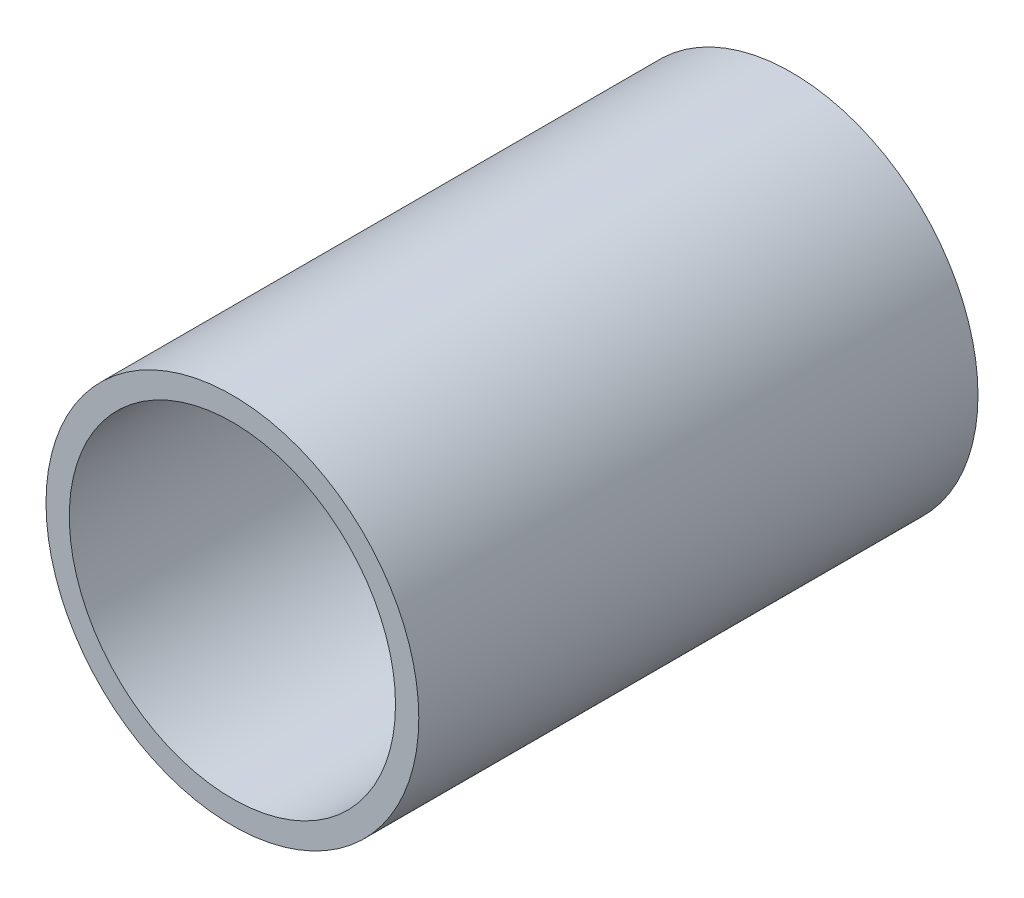
ISO-10303-21;
HEADER;
FILE_DESCRIPTION(('STEP AP214'),'2;1');
FILE_NAME('part.step','',(''),(''),'','','');
FILE_SCHEMA(('AUTOMOTIVE_DESIGN { 1 0 10303 214 1 1 1 1 }'));
ENDSEC;
DATA;
#1=APPLICATION_CONTEXT('core data for automotive mechanical design processes');
#2=APPLICATION_PROTOCOL_DEFINITION('international standard','automotive_design',2000,#1);
#3=PRODUCT_CONTEXT('',#1,'mechanical');
#4=PRODUCT('Part','Part','',(#3));
#5=PRODUCT_RELATED_PRODUCT_CATEGORY('part','',(#4));
#6=PRODUCT_DEFINITION_FORMATION('','',#4);
#7=PRODUCT_DEFINITION_CONTEXT('part definition',#1,'design');
#8=PRODUCT_DEFINITION('design','',#6,#7);
#9=PRODUCT_DEFINITION_SHAPE('','',#8);
#10=(LENGTH_UNIT() NAMED_UNIT(*) SI_UNIT(.MILLI.,.METRE.));
#11=(NAMED_UNIT(*) PLANE_ANGLE_UNIT() SI_UNIT($,.RADIAN.));
#12=(NAMED_UNIT(*) SI_UNIT($,.STERADIAN.) SOLID_ANGLE_UNIT());
#13=UNCERTAINTY_MEASURE_WITH_UNIT(LENGTH_MEASURE(1.E-05),#10,'distance_accuracy_value','');
#14=(GEOMETRIC_REPRESENTATION_CONTEXT(3) GLOBAL_UNCERTAINTY_ASSIGNED_CONTEXT((#13)) GLOBAL_UNIT_ASSIGNED_CONTEXT((#10,
#11,#12)) REPRESENTATION_CONTEXT('',''));
#15=CARTESIAN_POINT('',(0.,0.,0.));
#16=DIRECTION('',(0.,0.,1.));
#17=DIRECTION('',(1.,0.,0.));
#18=AXIS2_PLACEMENT_3D('',#15,#16,#17);
#19=CARTESIAN_POINT('',(0.,0.,24.));
#20=DIRECTION('',(0.,0.,1.));
#21=DIRECTION('',(1.,0.,0.));
#22=AXIS2_PLACEMENT_3D('',#19,#20,#21);
#23=PLANE('',#22);
#24=CARTESIAN_POINT('',(0.,0.,24.));
#25=DIRECTION('',(0.,0.,1.));
#26=DIRECTION('',(1.,0.,0.));
#27=AXIS2_PLACEMENT_3D('',#24,#25,#26);
#28=CIRCLE('',#27,8.);
#29=CARTESIAN_POINT('',(8.,0.,24.));
#30=VERTEX_POINT('',#29);
#31=EDGE_CURVE('E10',#30,#30,#28,.T.);
#32=ORIENTED_EDGE('',*,*,#31,.T.);
#33=EDGE_LOOP('',(#32));
#34=FACE_BOUND('',#33,.T.);
#35=CARTESIAN_POINT('',(0.,0.,24.));
#36=DIRECTION('',(0.,0.,1.));
#37=DIRECTION('',(1.,0.,0.));
#38=AXIS2_PLACEMENT_3D('',#35,#36,#37);
#39=CIRCLE('',#38,7.00000000004495);
#40=CARTESIAN_POINT('',(7.00000000004495,0.,24.));
#41=VERTEX_POINT('',#40);
#42=EDGE_CURVE('E52',#41,#41,#39,.T.);
#43=ORIENTED_EDGE('',*,*,#42,.F.);
#44=EDGE_LOOP('',(#43));
#45=FACE_BOUND('',#44,.T.);
#46=ADVANCED_FACE('F41',(#34,#45),#23,.T.);
#47=CARTESIAN_POINT('',(0.,0.,0.));
#48=DIRECTION('',(0.,0.,1.));
#49=DIRECTION('',(1.,0.,0.));
#50=AXIS2_PLACEMENT_3D('',#47,#48,#49);
#51=PLANE('',#50);
#52=CARTESIAN_POINT('',(0.,0.,0.));
#53=DIRECTION('',(0.,0.,1.));
#54=DIRECTION('',(1.,0.,0.));
#55=AXIS2_PLACEMENT_3D('',#52,#53,#54);
#56=CIRCLE('',#55,8.);
#57=CARTESIAN_POINT('',(8.,0.,0.));
#58=VERTEX_POINT('',#57);
#59=EDGE_CURVE('E45',#58,#58,#56,.T.);
#60=ORIENTED_EDGE('',*,*,#59,.F.);
#61=EDGE_LOOP('',(#60));
#62=FACE_BOUND('',#61,.T.);
#63=CARTESIAN_POINT('',(0.,0.,0.));
#64=DIRECTION('',(0.,0.,1.));
#65=DIRECTION('',(1.,0.,0.));
#66=AXIS2_PLACEMENT_3D('',#63,#64,#65);
#67=CIRCLE('',#66,7.00000000004495);
#68=CARTESIAN_POINT('',(7.00000000004495,0.,0.));
#69=VERTEX_POINT('',#68);
#70=EDGE_CURVE('E54',#69,#69,#67,.T.);
#71=ORIENTED_EDGE('',*,*,#70,.T.);
#72=EDGE_LOOP('',(#71));
#73=FACE_BOUND('',#72,.T.);
#74=ADVANCED_FACE('F64',(#62,#73),#51,.F.);
#75=CARTESIAN_POINT('',(0.,0.,24.));
#76=DIRECTION('',(0.,0.,-1.));
#77=DIRECTION('',(-1.,0.,0.));
#78=AXIS2_PLACEMENT_3D('',#75,#76,#77);
#79=CYLINDRICAL_SURFACE('',#78,8.);
#80=ORIENTED_EDGE('',*,*,#31,.F.);
#81=EDGE_LOOP('',(#80));
#82=FACE_BOUND('',#81,.T.);
#83=ORIENTED_EDGE('',*,*,#59,.T.);
#84=EDGE_LOOP('',(#83));
#85=FACE_BOUND('',#84,.T.);
#86=ADVANCED_FACE('F43',(#82,#85),#79,.T.);
#87=CARTESIAN_POINT('',(0.,0.,24.));
#88=DIRECTION('',(0.,0.,-1.));
#89=DIRECTION('',(-1.,0.,0.));
#90=AXIS2_PLACEMENT_3D('',#87,#88,#89);
#91=CYLINDRICAL_SURFACE('',#90,7.00000000004495);
#92=ORIENTED_EDGE('',*,*,#42,.T.);
#93=EDGE_LOOP('',(#92));
#94=FACE_BOUND('',#93,.T.);
#95=ORIENTED_EDGE('',*,*,#70,.F.);
#96=EDGE_LOOP('',(#95));
#97=FACE_BOUND('',#96,.T.);
#98=ADVANCED_FACE('F60',(#94,#97),#91,.F.);
#99=CLOSED_SHELL('',(#46,#74,#86,#98));
#100=MANIFOLD_SOLID_BREP('B2',#99);
#101=ADVANCED_BREP_SHAPE_REPRESENTATION('',(#18,#100),#14);
#102=SHAPE_DEFINITION_REPRESENTATION(#9,#101);
ENDSEC;
END-ISO-10303-21;
